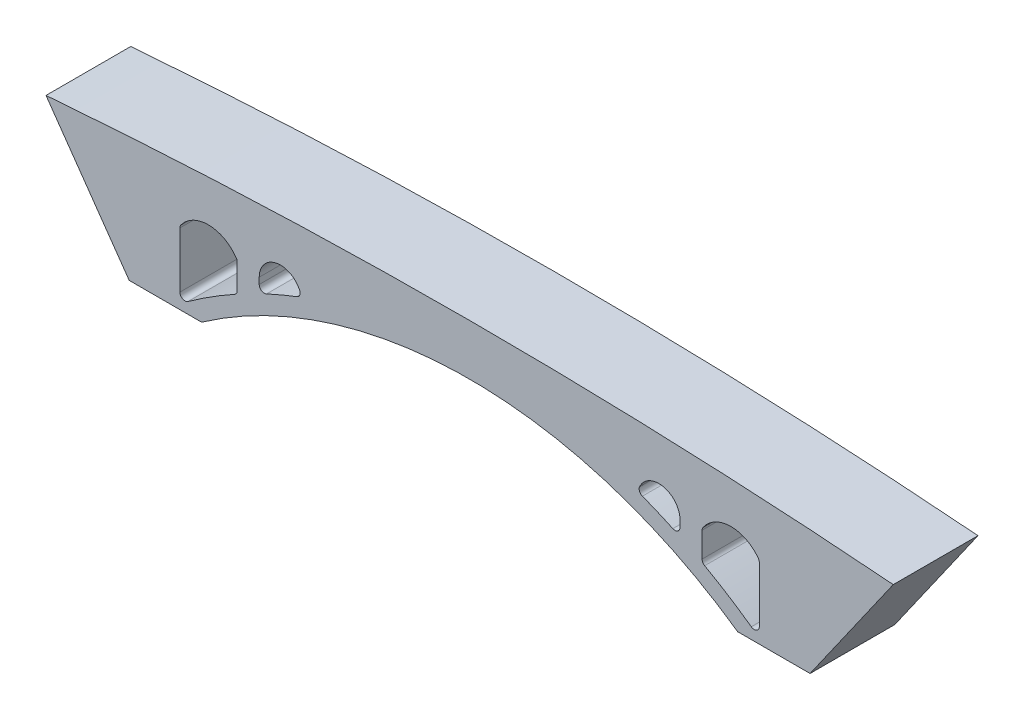
ISO-10303-21;
HEADER;
FILE_DESCRIPTION(('STEP AP214'),'2;1');
FILE_NAME('part.step','',(''),(''),'','','');
FILE_SCHEMA(('AUTOMOTIVE_DESIGN { 1 0 10303 214 1 1 1 1 }'));
ENDSEC;
DATA;
#1=APPLICATION_CONTEXT('core data for automotive mechanical design processes');
#2=APPLICATION_PROTOCOL_DEFINITION('international standard','automotive_design',2000,#1);
#3=PRODUCT_CONTEXT('',#1,'mechanical');
#4=PRODUCT('Part','Part','',(#3));
#5=PRODUCT_RELATED_PRODUCT_CATEGORY('part','',(#4));
#6=PRODUCT_DEFINITION_FORMATION('','',#4);
#7=PRODUCT_DEFINITION_CONTEXT('part definition',#1,'design');
#8=PRODUCT_DEFINITION('design','',#6,#7);
#9=PRODUCT_DEFINITION_SHAPE('','',#8);
#10=(LENGTH_UNIT() NAMED_UNIT(*) SI_UNIT(.MILLI.,.METRE.));
#11=(NAMED_UNIT(*) PLANE_ANGLE_UNIT() SI_UNIT($,.RADIAN.));
#12=(NAMED_UNIT(*) SI_UNIT($,.STERADIAN.) SOLID_ANGLE_UNIT());
#13=UNCERTAINTY_MEASURE_WITH_UNIT(LENGTH_MEASURE(1.E-05),#10,'distance_accuracy_value','');
#14=(GEOMETRIC_REPRESENTATION_CONTEXT(3) GLOBAL_UNCERTAINTY_ASSIGNED_CONTEXT((#13)) GLOBAL_UNIT_ASSIGNED_CONTEXT((#10,
#11,#12)) REPRESENTATION_CONTEXT('',''));
#15=CARTESIAN_POINT('',(0.,0.,0.));
#16=DIRECTION('',(0.,0.,1.));
#17=DIRECTION('',(1.,0.,0.));
#18=AXIS2_PLACEMENT_3D('',#15,#16,#17);
#19=CARTESIAN_POINT('',(137.172282430604,0.,50.));
#20=DIRECTION('',(1.,0.,0.));
#21=DIRECTION('',(0.,0.,-1.));
#22=AXIS2_PLACEMENT_3D('',#19,#20,#21);
#23=PLANE('',#22);
#24=DIRECTION('',(0.,-1.,0.));
#25=VECTOR('',#24,1.);
#26=CARTESIAN_POINT('',(137.172282430604,0.,50.));
#27=LINE('',#26,#25);
#28=CARTESIAN_POINT('',(137.172282430604,41.342093544758,50.));
#29=VERTEX_POINT('',#28);
#30=CARTESIAN_POINT('',(137.172282430604,26.6165555100309,50.));
#31=VERTEX_POINT('',#30);
#32=EDGE_CURVE('E492',#29,#31,#27,.T.);
#33=ORIENTED_EDGE('',*,*,#32,.T.);
#34=DIRECTION('',(0.,0.,1.));
#35=VECTOR('',#34,1.);
#36=CARTESIAN_POINT('',(137.172282430604,26.6165555100309,0.));
#37=LINE('',#36,#35);
#38=CARTESIAN_POINT('',(137.172282430604,26.6165555100309,0.));
#39=VERTEX_POINT('',#38);
#40=EDGE_CURVE('E306',#31,#39,#37,.F.);
#41=ORIENTED_EDGE('',*,*,#40,.T.);
#42=DIRECTION('',(0.,-1.,0.));
#43=VECTOR('',#42,1.);
#44=CARTESIAN_POINT('',(137.172282430604,0.,0.));
#45=LINE('',#44,#43);
#46=CARTESIAN_POINT('',(137.172282430604,41.342093544758,0.));
#47=VERTEX_POINT('',#46);
#48=EDGE_CURVE('E549',#47,#39,#45,.T.);
#49=ORIENTED_EDGE('',*,*,#48,.F.);
#50=DIRECTION('',(0.,0.,-1.));
#51=VECTOR('',#50,1.);
#52=CARTESIAN_POINT('',(137.172282430604,41.342093544758,50.));
#53=LINE('',#52,#51);
#54=EDGE_CURVE('E303',#47,#29,#53,.F.);
#55=ORIENTED_EDGE('',*,*,#54,.T.);
#56=EDGE_LOOP('',(#33,#41,#49,#55));
#57=FACE_BOUND('',#56,.T.);
#58=ADVANCED_FACE('F40',(#57),#23,.T.);
#59=CARTESIAN_POINT('',(154.22651526237,31.7776521334411,50.));
#60=DIRECTION('',(0.,0.,-1.));
#61=DIRECTION('',(-1.,0.,0.));
#62=AXIS2_PLACEMENT_3D('',#59,#60,#61);
#63=CYLINDRICAL_SURFACE('',#62,20.);
#64=CARTESIAN_POINT('',(154.22651526237,31.7776521334411,0.));
#65=DIRECTION('',(0.,0.,1.));
#66=DIRECTION('',(1.,0.,0.));
#67=AXIS2_PLACEMENT_3D('',#64,#65,#66);
#68=CIRCLE('',#67,20.);
#69=CARTESIAN_POINT('',(137.692123695587,43.0299361467551,0.));
#70=VERTEX_POINT('',#69);
#71=CARTESIAN_POINT('',(170.390355248021,43.5560338948833,0.));
#72=VERTEX_POINT('',#71);
#73=EDGE_CURVE('E553',#70,#72,#68,.F.);
#74=ORIENTED_EDGE('',*,*,#73,.T.);
#75=DIRECTION('',(0.,0.,-1.));
#76=VECTOR('',#75,1.);
#77=CARTESIAN_POINT('',(170.390355248021,43.5560338948833,50.));
#78=LINE('',#77,#76);
#79=CARTESIAN_POINT('',(170.390355248021,43.5560338948833,50.));
#80=VERTEX_POINT('',#79);
#81=EDGE_CURVE('E314',#72,#80,#78,.F.);
#82=ORIENTED_EDGE('',*,*,#81,.T.);
#83=CARTESIAN_POINT('',(154.22651526237,31.7776521334411,50.));
#84=DIRECTION('',(0.,0.,1.));
#85=DIRECTION('',(1.,0.,0.));
#86=AXIS2_PLACEMENT_3D('',#83,#84,#85);
#87=CIRCLE('',#86,20.);
#88=CARTESIAN_POINT('',(137.692123695587,43.0299361467551,50.));
#89=VERTEX_POINT('',#88);
#90=EDGE_CURVE('E496',#89,#80,#87,.F.);
#91=ORIENTED_EDGE('',*,*,#90,.F.);
#92=DIRECTION('',(0.,0.,-1.));
#93=VECTOR('',#92,1.);
#94=CARTESIAN_POINT('',(137.692123695587,43.0299361467551,50.));
#95=LINE('',#94,#93);
#96=EDGE_CURVE('E310',#89,#70,#95,.T.);
#97=ORIENTED_EDGE('',*,*,#96,.T.);
#98=EDGE_LOOP('',(#74,#82,#91,#97));
#99=FACE_BOUND('',#98,.T.);
#100=ADVANCED_FACE('F616',(#99),#63,.F.);
#101=CARTESIAN_POINT('',(170.965779250173,0.,50.));
#102=DIRECTION('',(1.,0.,0.));
#103=DIRECTION('',(0.,0.,-1.));
#104=AXIS2_PLACEMENT_3D('',#101,#102,#103);
#105=PLANE('',#104);
#106=DIRECTION('',(0.,-1.,0.));
#107=VECTOR('',#106,1.);
#108=CARTESIAN_POINT('',(170.965779250173,0.,0.));
#109=LINE('',#108,#107);
#110=CARTESIAN_POINT('',(170.965779250173,41.789276630667,0.));
#111=VERTEX_POINT('',#110);
#112=CARTESIAN_POINT('',(170.965779250173,8.99572385539235,0.));
#113=VERTEX_POINT('',#112);
#114=EDGE_CURVE('E557',#111,#113,#109,.T.);
#115=ORIENTED_EDGE('',*,*,#114,.T.);
#116=DIRECTION('',(0.,0.,-1.));
#117=VECTOR('',#116,1.);
#118=CARTESIAN_POINT('',(170.965779250173,8.99572385539235,50.));
#119=LINE('',#118,#117);
#120=CARTESIAN_POINT('',(170.965779250173,8.99572385539235,50.));
#121=VERTEX_POINT('',#120);
#122=EDGE_CURVE('E300',#113,#121,#119,.F.);
#123=ORIENTED_EDGE('',*,*,#122,.T.);
#124=DIRECTION('',(0.,-1.,0.));
#125=VECTOR('',#124,1.);
#126=CARTESIAN_POINT('',(170.965779250173,0.,50.));
#127=LINE('',#126,#125);
#128=CARTESIAN_POINT('',(170.965779250173,41.789276630667,50.));
#129=VERTEX_POINT('',#128);
#130=EDGE_CURVE('E500',#129,#121,#127,.T.);
#131=ORIENTED_EDGE('',*,*,#130,.F.);
#132=DIRECTION('',(0.,0.,1.));
#133=VECTOR('',#132,1.);
#134=CARTESIAN_POINT('',(170.965779250173,41.789276630667,0.));
#135=LINE('',#134,#133);
#136=EDGE_CURVE('E296',#129,#111,#135,.F.);
#137=ORIENTED_EDGE('',*,*,#136,.T.);
#138=EDGE_LOOP('',(#115,#123,#131,#137));
#139=FACE_BOUND('',#138,.T.);
#140=ADVANCED_FACE('F622',(#139),#105,.F.);
#141=CARTESIAN_POINT('',(0.,-225.208333333333,50.));
#142=DIRECTION('',(0.,0.,-1.));
#143=DIRECTION('',(-1.,0.,0.));
#144=AXIS2_PLACEMENT_3D('',#141,#142,#143);
#145=CYLINDRICAL_SURFACE('',#144,285.208333333333);
#146=CARTESIAN_POINT('',(0.,-225.208333333333,50.));
#147=DIRECTION('',(0.,0.,1.));
#148=DIRECTION('',(1.,0.,0.));
#149=AXIS2_PLACEMENT_3D('',#146,#147,#148);
#150=CIRCLE('',#149,285.208333333333);
#151=CARTESIAN_POINT('',(101.960983889552,41.1518573240777,50.));
#152=VERTEX_POINT('',#151);
#153=CARTESIAN_POINT('',(119.9109835532,33.5679202644069,50.));
#154=VERTEX_POINT('',#153);
#155=EDGE_CURVE('E484',#152,#154,#150,.F.);
#156=ORIENTED_EDGE('',*,*,#155,.T.);
#157=DIRECTION('',(0.,0.,-1.));
#158=VECTOR('',#157,1.);
#159=CARTESIAN_POINT('',(119.9109835532,33.567920264407,50.));
#160=LINE('',#159,#158);
#161=CARTESIAN_POINT('',(119.9109835532,33.5679202644069,0.));
#162=VERTEX_POINT('',#161);
#163=EDGE_CURVE('E320',#154,#162,#160,.T.);
#164=ORIENTED_EDGE('',*,*,#163,.T.);
#165=CARTESIAN_POINT('',(0.,-225.208333333333,0.));
#166=DIRECTION('',(0.,0.,1.));
#167=DIRECTION('',(1.,0.,0.));
#168=AXIS2_PLACEMENT_3D('',#165,#166,#167);
#169=CIRCLE('',#168,285.208333333333);
#170=CARTESIAN_POINT('',(101.960983889552,41.1518573240777,0.));
#171=VERTEX_POINT('',#170);
#172=EDGE_CURVE('E541',#171,#162,#169,.F.);
#173=ORIENTED_EDGE('',*,*,#172,.F.);
#174=DIRECTION('',(0.,0.,-1.));
#175=VECTOR('',#174,1.);
#176=CARTESIAN_POINT('',(101.960983889552,41.1518573240777,50.));
#177=LINE('',#176,#175);
#178=EDGE_CURVE('E317',#171,#152,#177,.F.);
#179=ORIENTED_EDGE('',*,*,#178,.T.);
#180=EDGE_LOOP('',(#156,#164,#173,#179));
#181=FACE_BOUND('',#180,.T.);
#182=ADVANCED_FACE('F609',(#181),#145,.T.);
#183=CARTESIAN_POINT('',(111.672282430604,40.0012623389559,50.));
#184=DIRECTION('',(0.,0.,-1.));
#185=DIRECTION('',(-1.,0.,0.));
#186=AXIS2_PLACEMENT_3D('',#183,#184,#185);
#187=CYLINDRICAL_SURFACE('',#186,12.5);
#188=CARTESIAN_POINT('',(111.672282430604,40.0012623389559,50.));
#189=DIRECTION('',(0.,0.,1.));
#190=DIRECTION('',(1.,0.,0.));
#191=AXIS2_PLACEMENT_3D('',#188,#189,#190);
#192=CIRCLE('',#191,12.5);
#193=CARTESIAN_POINT('',(100.305428470077,45.2017076122041,50.));
#194=VERTEX_POINT('',#193);
#195=CARTESIAN_POINT('',(124.172282430604,40.0012623389559,50.));
#196=VERTEX_POINT('',#195);
#197=EDGE_CURVE('E485',#194,#196,#192,.F.);
#198=ORIENTED_EDGE('',*,*,#197,.F.);
#199=DIRECTION('',(0.,0.,-1.));
#200=VECTOR('',#199,1.);
#201=CARTESIAN_POINT('',(100.305428470077,45.2017076122041,50.));
#202=LINE('',#201,#200);
#203=CARTESIAN_POINT('',(100.305428470077,45.2017076122041,0.));
#204=VERTEX_POINT('',#203);
#205=EDGE_CURVE('E327',#194,#204,#202,.T.);
#206=ORIENTED_EDGE('',*,*,#205,.T.);
#207=CARTESIAN_POINT('',(111.672282430604,40.0012623389559,0.));
#208=DIRECTION('',(0.,0.,1.));
#209=DIRECTION('',(1.,0.,0.));
#210=AXIS2_PLACEMENT_3D('',#207,#208,#209);
#211=CIRCLE('',#210,12.5);
#212=CARTESIAN_POINT('',(124.172282430604,40.0012623389559,0.));
#213=VERTEX_POINT('',#212);
#214=EDGE_CURVE('E542',#204,#213,#211,.F.);
#215=ORIENTED_EDGE('',*,*,#214,.T.);
#216=DIRECTION('',(0.,0.,-1.));
#217=VECTOR('',#216,1.);
#218=CARTESIAN_POINT('',(124.172282430604,40.0012623389559,50.));
#219=LINE('',#218,#217);
#220=EDGE_CURVE('E283',#196,#213,#219,.T.);
#221=ORIENTED_EDGE('',*,*,#220,.F.);
#222=EDGE_LOOP('',(#198,#206,#215,#221));
#223=FACE_BOUND('',#222,.T.);
#224=ADVANCED_FACE('F631',(#223),#187,.F.);
#225=CARTESIAN_POINT('',(-119.9109835532,33.5679202644069,50.));
#226=VERTEX_POINT('',#225);
#227=CARTESIAN_POINT('',(-101.960983889553,41.1518573240774,50.));
#228=VERTEX_POINT('',#227);
#229=EDGE_CURVE('E470',#226,#228,#150,.F.);
#230=ORIENTED_EDGE('',*,*,#229,.T.);
#231=DIRECTION('',(0.,0.,-1.));
#232=VECTOR('',#231,1.);
#233=CARTESIAN_POINT('',(-101.960983889553,41.1518573240774,50.));
#234=LINE('',#233,#232);
#235=CARTESIAN_POINT('',(-101.960983889553,41.1518573240774,0.));
#236=VERTEX_POINT('',#235);
#237=EDGE_CURVE('E334',#228,#236,#234,.T.);
#238=ORIENTED_EDGE('',*,*,#237,.T.);
#239=CARTESIAN_POINT('',(-119.9109835532,33.5679202644069,0.));
#240=VERTEX_POINT('',#239);
#241=EDGE_CURVE('E456',#240,#236,#169,.F.);
#242=ORIENTED_EDGE('',*,*,#241,.F.);
#243=DIRECTION('',(0.,0.,-1.));
#244=VECTOR('',#243,1.);
#245=CARTESIAN_POINT('',(-119.9109835532,33.567920264407,50.));
#246=LINE('',#245,#244);
#247=EDGE_CURVE('E331',#240,#226,#246,.F.);
#248=ORIENTED_EDGE('',*,*,#247,.T.);
#249=EDGE_LOOP('',(#230,#238,#242,#248));
#250=FACE_BOUND('',#249,.T.);
#251=ADVANCED_FACE('F634',(#250),#145,.T.);
#252=CARTESIAN_POINT('',(-124.172282430604,2.03912069555012E-13,50.));
#253=DIRECTION('',(1.,0.,0.));
#254=DIRECTION('',(0.,1.,0.));
#255=AXIS2_PLACEMENT_3D('',#252,#253,#254);
#256=PLANE('',#255);
#257=DIRECTION('',(0.,-1.,0.));
#258=VECTOR('',#257,1.);
#259=CARTESIAN_POINT('',(-124.172282430604,2.03912069555012E-13,50.));
#260=LINE('',#259,#258);
#261=CARTESIAN_POINT('',(-124.172282430604,40.0012623389559,50.));
#262=VERTEX_POINT('',#261);
#263=CARTESIAN_POINT('',(-124.172282430604,36.2898910838427,50.));
#264=VERTEX_POINT('',#263);
#265=EDGE_CURVE('E477',#262,#264,#260,.T.);
#266=ORIENTED_EDGE('',*,*,#265,.T.);
#267=DIRECTION('',(0.,0.,1.));
#268=VECTOR('',#267,1.);
#269=CARTESIAN_POINT('',(-124.172282430604,36.2898910838427,0.));
#270=LINE('',#269,#268);
#271=CARTESIAN_POINT('',(-124.172282430604,36.2898910838427,0.));
#272=VERTEX_POINT('',#271);
#273=EDGE_CURVE('E341',#264,#272,#270,.F.);
#274=ORIENTED_EDGE('',*,*,#273,.T.);
#275=DIRECTION('',(0.,-1.,0.));
#276=VECTOR('',#275,1.);
#277=CARTESIAN_POINT('',(-124.172282430604,2.03912069555012E-13,0.));
#278=LINE('',#277,#276);
#279=CARTESIAN_POINT('',(-124.172282430604,40.0012623389559,0.));
#280=VERTEX_POINT('',#279);
#281=EDGE_CURVE('E534',#280,#272,#278,.T.);
#282=ORIENTED_EDGE('',*,*,#281,.F.);
#283=DIRECTION('',(0.,0.,-1.));
#284=VECTOR('',#283,1.);
#285=CARTESIAN_POINT('',(-124.172282430604,40.0012623389559,50.));
#286=LINE('',#285,#284);
#287=EDGE_CURVE('E278',#262,#280,#286,.T.);
#288=ORIENTED_EDGE('',*,*,#287,.F.);
#289=EDGE_LOOP('',(#266,#274,#282,#288));
#290=FACE_BOUND('',#289,.T.);
#291=ADVANCED_FACE('F639',(#290),#256,.T.);
#292=CARTESIAN_POINT('',(-166.21740045792,6.55786175945652,50.));
#293=VERTEX_POINT('',#292);
#294=CARTESIAN_POINT('',(-138.713209951928,23.9952757649504,50.));
#295=VERTEX_POINT('',#294);
#296=EDGE_CURVE('E462',#293,#295,#150,.F.);
#297=ORIENTED_EDGE('',*,*,#296,.T.);
#298=DIRECTION('',(0.,0.,-1.));
#299=VECTOR('',#298,1.);
#300=CARTESIAN_POINT('',(-138.713209951928,23.9952757649504,50.));
#301=LINE('',#300,#299);
#302=CARTESIAN_POINT('',(-138.713209951928,23.9952757649504,0.));
#303=VERTEX_POINT('',#302);
#304=EDGE_CURVE('E348',#295,#303,#301,.T.);
#305=ORIENTED_EDGE('',*,*,#304,.T.);
#306=CARTESIAN_POINT('',(-166.21740045792,6.55786175945652,0.));
#307=VERTEX_POINT('',#306);
#308=EDGE_CURVE('E444',#307,#303,#169,.F.);
#309=ORIENTED_EDGE('',*,*,#308,.F.);
#310=DIRECTION('',(0.,0.,-1.));
#311=VECTOR('',#310,1.);
#312=CARTESIAN_POINT('',(-166.21740045792,6.55786175945652,50.));
#313=LINE('',#312,#311);
#314=EDGE_CURVE('E345',#307,#293,#313,.F.);
#315=ORIENTED_EDGE('',*,*,#314,.T.);
#316=EDGE_LOOP('',(#297,#305,#309,#315));
#317=FACE_BOUND('',#316,.T.);
#318=ADVANCED_FACE('F451',(#317),#145,.T.);
#319=CARTESIAN_POINT('',(-170.965779250173,0.,50.));
#320=DIRECTION('',(1.,0.,0.));
#321=DIRECTION('',(0.,0.,-1.));
#322=AXIS2_PLACEMENT_3D('',#319,#320,#321);
#323=PLANE('',#322);
#324=DIRECTION('',(0.,-1.,0.));
#325=VECTOR('',#324,1.);
#326=CARTESIAN_POINT('',(-170.965779250173,0.,0.));
#327=LINE('',#326,#325);
#328=CARTESIAN_POINT('',(-170.965779250173,41.789276630667,0.));
#329=VERTEX_POINT('',#328);
#330=CARTESIAN_POINT('',(-170.965779250173,8.99572385539235,0.));
#331=VERTEX_POINT('',#330);
#332=EDGE_CURVE('E445',#329,#331,#327,.T.);
#333=ORIENTED_EDGE('',*,*,#332,.F.);
#334=DIRECTION('',(0.,0.,1.));
#335=VECTOR('',#334,1.);
#336=CARTESIAN_POINT('',(-170.965779250173,41.789276630667,50.));
#337=LINE('',#336,#335);
#338=CARTESIAN_POINT('',(-170.965779250173,41.789276630667,50.));
#339=VERTEX_POINT('',#338);
#340=EDGE_CURVE('E61',#329,#339,#337,.T.);
#341=ORIENTED_EDGE('',*,*,#340,.T.);
#342=DIRECTION('',(0.,-1.,0.));
#343=VECTOR('',#342,1.);
#344=CARTESIAN_POINT('',(-170.965779250173,0.,50.));
#345=LINE('',#344,#343);
#346=CARTESIAN_POINT('',(-170.965779250173,8.99572385539235,50.));
#347=VERTEX_POINT('',#346);
#348=EDGE_CURVE('E458',#339,#347,#345,.T.);
#349=ORIENTED_EDGE('',*,*,#348,.T.);
#350=DIRECTION('',(0.,0.,1.));
#351=VECTOR('',#350,1.);
#352=CARTESIAN_POINT('',(-170.965779250173,8.99572385539235,0.));
#353=LINE('',#352,#351);
#354=EDGE_CURVE('E366',#347,#331,#353,.F.);
#355=ORIENTED_EDGE('',*,*,#354,.T.);
#356=EDGE_LOOP('',(#333,#341,#349,#355));
#357=FACE_BOUND('',#356,.T.);
#358=ADVANCED_FACE('F457',(#357),#323,.T.);
#359=CARTESIAN_POINT('',(-154.22651526237,31.7776521334411,50.));
#360=DIRECTION('',(0.,0.,-1.));
#361=DIRECTION('',(-1.,0.,0.));
#362=AXIS2_PLACEMENT_3D('',#359,#360,#361);
#363=CYLINDRICAL_SURFACE('',#362,20.);
#364=CARTESIAN_POINT('',(-154.22651526237,31.7776521334411,0.));
#365=DIRECTION('',(0.,0.,1.));
#366=DIRECTION('',(1.,0.,0.));
#367=AXIS2_PLACEMENT_3D('',#364,#365,#366);
#368=CIRCLE('',#367,20.);
#369=CARTESIAN_POINT('',(-137.692123695587,43.0299361467551,0.));
#370=VERTEX_POINT('',#369);
#371=CARTESIAN_POINT('',(-170.390355248021,43.5560338948833,0.));
#372=VERTEX_POINT('',#371);
#373=EDGE_CURVE('E526',#370,#372,#368,.T.);
#374=ORIENTED_EDGE('',*,*,#373,.F.);
#375=DIRECTION('',(0.,0.,-1.));
#376=VECTOR('',#375,1.);
#377=CARTESIAN_POINT('',(-137.692123695587,43.0299361467551,50.));
#378=LINE('',#377,#376);
#379=CARTESIAN_POINT('',(-137.692123695587,43.0299361467551,50.));
#380=VERTEX_POINT('',#379);
#381=EDGE_CURVE('E363',#370,#380,#378,.F.);
#382=ORIENTED_EDGE('',*,*,#381,.T.);
#383=CARTESIAN_POINT('',(-154.22651526237,31.7776521334411,50.));
#384=DIRECTION('',(0.,0.,1.));
#385=DIRECTION('',(1.,0.,0.));
#386=AXIS2_PLACEMENT_3D('',#383,#384,#385);
#387=CIRCLE('',#386,20.);
#388=CARTESIAN_POINT('',(-170.390355248021,43.5560338948833,50.));
#389=VERTEX_POINT('',#388);
#390=EDGE_CURVE('E461',#380,#389,#387,.T.);
#391=ORIENTED_EDGE('',*,*,#390,.T.);
#392=DIRECTION('',(0.,0.,-1.));
#393=VECTOR('',#392,1.);
#394=CARTESIAN_POINT('',(-170.390355248021,43.5560338948833,50.));
#395=LINE('',#394,#393);
#396=EDGE_CURVE('E359',#389,#372,#395,.T.);
#397=ORIENTED_EDGE('',*,*,#396,.T.);
#398=EDGE_LOOP('',(#374,#382,#391,#397));
#399=FACE_BOUND('',#398,.T.);
#400=ADVANCED_FACE('F643',(#399),#363,.F.);
#401=CARTESIAN_POINT('',(0.,-225.208333333333,50.));
#402=DIRECTION('',(0.,0.,-1.));
#403=DIRECTION('',(-1.,0.,0.));
#404=AXIS2_PLACEMENT_3D('',#401,#402,#403);
#405=CYLINDRICAL_SURFACE('',#404,275.208333333333);
#406=CARTESIAN_POINT('',(0.,-225.208333333333,0.));
#407=DIRECTION('',(0.,0.,1.));
#408=DIRECTION('',(1.,0.,0.));
#409=AXIS2_PLACEMENT_3D('',#406,#407,#408);
#410=CIRCLE('',#409,275.208333333333);
#411=CARTESIAN_POINT('',(-158.179750073558,0.,0.));
#412=VERTEX_POINT('',#411);
#413=CARTESIAN_POINT('',(158.179750073558,0.,0.));
#414=VERTEX_POINT('',#413);
#415=EDGE_CURVE('E276',#412,#414,#410,.F.);
#416=ORIENTED_EDGE('',*,*,#415,.T.);
#417=DIRECTION('',(0.,0.,-1.));
#418=VECTOR('',#417,1.);
#419=CARTESIAN_POINT('',(158.179750073558,0.,50.));
#420=LINE('',#419,#418);
#421=CARTESIAN_POINT('',(158.179750073558,0.,50.));
#422=VERTEX_POINT('',#421);
#423=EDGE_CURVE('E254',#422,#414,#420,.T.);
#424=ORIENTED_EDGE('',*,*,#423,.F.);
#425=CARTESIAN_POINT('',(0.,-225.208333333333,50.));
#426=DIRECTION('',(0.,0.,1.));
#427=DIRECTION('',(1.,0.,0.));
#428=AXIS2_PLACEMENT_3D('',#425,#426,#427);
#429=CIRCLE('',#428,275.208333333333);
#430=CARTESIAN_POINT('',(-158.179750073558,0.,50.));
#431=VERTEX_POINT('',#430);
#432=EDGE_CURVE('E262',#431,#422,#429,.F.);
#433=ORIENTED_EDGE('',*,*,#432,.F.);
#434=DIRECTION('',(0.,0.,-1.));
#435=VECTOR('',#434,1.);
#436=CARTESIAN_POINT('',(-158.179750073558,0.,50.));
#437=LINE('',#436,#435);
#438=EDGE_CURVE('E564',#431,#412,#437,.T.);
#439=ORIENTED_EDGE('',*,*,#438,.T.);
#440=EDGE_LOOP('',(#416,#424,#433,#439));
#441=FACE_BOUND('',#440,.T.);
#442=ADVANCED_FACE('F274',(#441),#405,.F.);
#443=CARTESIAN_POINT('',(0.,0.,50.));
#444=DIRECTION('',(0.,1.,0.));
#445=DIRECTION('',(-1.,0.,0.));
#446=AXIS2_PLACEMENT_3D('',#443,#444,#445);
#447=PLANE('',#446);
#448=DIRECTION('',(1.,0.,0.));
#449=VECTOR('',#448,1.);
#450=CARTESIAN_POINT('',(0.,0.,0.));
#451=LINE('',#450,#449);
#452=CARTESIAN_POINT('',(200.898692043506,-4.52089729206739E-13,0.));
#453=VERTEX_POINT('',#452);
#454=EDGE_CURVE('E506',#414,#453,#451,.T.);
#455=ORIENTED_EDGE('',*,*,#454,.T.);
#456=DIRECTION('',(0.,0.,-1.));
#457=VECTOR('',#456,1.);
#458=CARTESIAN_POINT('',(200.898692043506,-4.52089729206739E-13,50.));
#459=LINE('',#458,#457);
#460=CARTESIAN_POINT('',(200.898692043506,-4.52089729206739E-13,50.));
#461=VERTEX_POINT('',#460);
#462=EDGE_CURVE('E257',#461,#453,#459,.T.);
#463=ORIENTED_EDGE('',*,*,#462,.F.);
#464=DIRECTION('',(1.,0.,0.));
#465=VECTOR('',#464,1.);
#466=CARTESIAN_POINT('',(0.,0.,50.));
#467=LINE('',#466,#465);
#468=EDGE_CURVE('E250',#422,#461,#467,.T.);
#469=ORIENTED_EDGE('',*,*,#468,.F.);
#470=ORIENTED_EDGE('',*,*,#423,.T.);
#471=EDGE_LOOP('',(#455,#463,#469,#470));
#472=FACE_BOUND('',#471,.T.);
#473=ADVANCED_FACE('F252',(#472),#447,.F.);
#474=CARTESIAN_POINT('',(134.648048083423,-94.44850392407,50.));
#475=DIRECTION('',(-0.818674901831811,0.574257263872799,0.));
#476=DIRECTION('',(-0.574257263872799,-0.818674901831811,0.));
#477=AXIS2_PLACEMENT_3D('',#474,#475,#476);
#478=PLANE('',#477);
#479=DIRECTION('',(0.5742572638728,0.818674901831811,0.));
#480=VECTOR('',#479,1.);
#481=CARTESIAN_POINT('',(134.648048083423,-94.44850392407,0.));
#482=LINE('',#481,#480);
#483=CARTESIAN_POINT('',(250.,70.,0.));
#484=VERTEX_POINT('',#483);
#485=EDGE_CURVE('E509',#453,#484,#482,.T.);
#486=ORIENTED_EDGE('',*,*,#485,.T.);
#487=DIRECTION('',(0.,0.,-1.));
#488=VECTOR('',#487,1.);
#489=CARTESIAN_POINT('',(250.,70.,50.));
#490=LINE('',#489,#488);
#491=CARTESIAN_POINT('',(250.,70.,50.));
#492=VERTEX_POINT('',#491);
#493=EDGE_CURVE('E285',#492,#484,#490,.T.);
#494=ORIENTED_EDGE('',*,*,#493,.F.);
#495=DIRECTION('',(0.5742572638728,0.818674901831811,0.));
#496=VECTOR('',#495,1.);
#497=CARTESIAN_POINT('',(134.648048083423,-94.44850392407,50.));
#498=LINE('',#497,#496);
#499=EDGE_CURVE('E261',#461,#492,#498,.T.);
#500=ORIENTED_EDGE('',*,*,#499,.F.);
#501=ORIENTED_EDGE('',*,*,#462,.T.);
#502=EDGE_LOOP('',(#486,#494,#500,#501));
#503=FACE_BOUND('',#502,.T.);
#504=ADVANCED_FACE('F582',(#503),#478,.F.);
#505=CARTESIAN_POINT('',(0.,-3049.99999999999,50.));
#506=DIRECTION('',(0.,0.,-1.));
#507=DIRECTION('',(-1.,0.,0.));
#508=AXIS2_PLACEMENT_3D('',#505,#506,#507);
#509=CYLINDRICAL_SURFACE('',#508,3129.99999999999);
#510=CARTESIAN_POINT('',(0.,-3049.99999999999,0.));
#511=DIRECTION('',(0.,0.,1.));
#512=DIRECTION('',(1.,0.,0.));
#513=AXIS2_PLACEMENT_3D('',#510,#511,#512);
#514=CIRCLE('',#513,3129.99999999999);
#515=CARTESIAN_POINT('',(-250.,70.,0.));
#516=VERTEX_POINT('',#515);
#517=EDGE_CURVE('E513',#516,#484,#514,.F.);
#518=ORIENTED_EDGE('',*,*,#517,.F.);
#519=DIRECTION('',(0.,0.,-1.));
#520=VECTOR('',#519,1.);
#521=CARTESIAN_POINT('',(-250.,70.,50.));
#522=LINE('',#521,#520);
#523=CARTESIAN_POINT('',(-250.,70.,50.));
#524=VERTEX_POINT('',#523);
#525=EDGE_CURVE('E570',#524,#516,#522,.T.);
#526=ORIENTED_EDGE('',*,*,#525,.F.);
#527=CARTESIAN_POINT('',(0.,-3049.99999999999,50.));
#528=DIRECTION('',(0.,0.,1.));
#529=DIRECTION('',(1.,0.,0.));
#530=AXIS2_PLACEMENT_3D('',#527,#528,#529);
#531=CIRCLE('',#530,3129.99999999999);
#532=EDGE_CURVE('E579',#524,#492,#531,.F.);
#533=ORIENTED_EDGE('',*,*,#532,.T.);
#534=ORIENTED_EDGE('',*,*,#493,.T.);
#535=EDGE_LOOP('',(#518,#526,#533,#534));
#536=FACE_BOUND('',#535,.T.);
#537=ADVANCED_FACE('F577',(#536),#509,.T.);
#538=CARTESIAN_POINT('',(-134.648048083423,-94.44850392407,50.));
#539=DIRECTION('',(-0.818674901831811,-0.574257263872799,0.));
#540=DIRECTION('',(0.574257263872799,-0.818674901831811,0.));
#541=AXIS2_PLACEMENT_3D('',#538,#539,#540);
#542=PLANE('',#541);
#543=DIRECTION('',(-0.5742572638728,0.818674901831811,0.));
#544=VECTOR('',#543,1.);
#545=CARTESIAN_POINT('',(-134.648048083423,-94.44850392407,0.));
#546=LINE('',#545,#544);
#547=CARTESIAN_POINT('',(-200.898692043506,3.79134478107815E-13,0.));
#548=VERTEX_POINT('',#547);
#549=EDGE_CURVE('E517',#548,#516,#546,.T.);
#550=ORIENTED_EDGE('',*,*,#549,.F.);
#551=DIRECTION('',(0.,0.,-1.));
#552=VECTOR('',#551,1.);
#553=CARTESIAN_POINT('',(-200.898692043506,3.79134478107815E-13,50.));
#554=LINE('',#553,#552);
#555=CARTESIAN_POINT('',(-200.898692043506,3.79134478107815E-13,50.));
#556=VERTEX_POINT('',#555);
#557=EDGE_CURVE('E567',#556,#548,#554,.T.);
#558=ORIENTED_EDGE('',*,*,#557,.F.);
#559=DIRECTION('',(-0.5742572638728,0.818674901831811,0.));
#560=VECTOR('',#559,1.);
#561=CARTESIAN_POINT('',(-134.648048083423,-94.44850392407,50.));
#562=LINE('',#561,#560);
#563=EDGE_CURVE('E589',#556,#524,#562,.T.);
#564=ORIENTED_EDGE('',*,*,#563,.T.);
#565=ORIENTED_EDGE('',*,*,#525,.T.);
#566=EDGE_LOOP('',(#550,#558,#564,#565));
#567=FACE_BOUND('',#566,.T.);
#568=ADVANCED_FACE('F587',(#567),#542,.T.);
#569=CARTESIAN_POINT('',(124.172282430604,2.03912069555012E-13,50.));
#570=DIRECTION('',(1.,0.,0.));
#571=DIRECTION('',(0.,1.,0.));
#572=AXIS2_PLACEMENT_3D('',#569,#570,#571);
#573=PLANE('',#572);
#574=DIRECTION('',(0.,-1.,0.));
#575=VECTOR('',#574,1.);
#576=CARTESIAN_POINT('',(124.172282430604,2.03912069555012E-13,0.));
#577=LINE('',#576,#575);
#578=CARTESIAN_POINT('',(124.172282430604,36.2898910838427,0.));
#579=VERTEX_POINT('',#578);
#580=EDGE_CURVE('E545',#213,#579,#577,.T.);
#581=ORIENTED_EDGE('',*,*,#580,.T.);
#582=DIRECTION('',(0.,0.,-1.));
#583=VECTOR('',#582,1.);
#584=CARTESIAN_POINT('',(124.172282430604,36.2898910838427,50.));
#585=LINE('',#584,#583);
#586=CARTESIAN_POINT('',(124.172282430604,36.2898910838427,50.));
#587=VERTEX_POINT('',#586);
#588=EDGE_CURVE('E324',#579,#587,#585,.F.);
#589=ORIENTED_EDGE('',*,*,#588,.T.);
#590=DIRECTION('',(0.,-1.,0.));
#591=VECTOR('',#590,1.);
#592=CARTESIAN_POINT('',(124.172282430604,2.03912069555012E-13,50.));
#593=LINE('',#592,#591);
#594=EDGE_CURVE('E488',#196,#587,#593,.T.);
#595=ORIENTED_EDGE('',*,*,#594,.F.);
#596=ORIENTED_EDGE('',*,*,#220,.T.);
#597=EDGE_LOOP('',(#581,#589,#595,#596));
#598=FACE_BOUND('',#597,.T.);
#599=ADVANCED_FACE('F627',(#598),#573,.F.);
#600=CARTESIAN_POINT('',(-111.672282430604,40.0012623389559,50.));
#601=DIRECTION('',(0.,0.,-1.));
#602=DIRECTION('',(-1.,0.,0.));
#603=AXIS2_PLACEMENT_3D('',#600,#601,#602);
#604=CYLINDRICAL_SURFACE('',#603,12.5);
#605=CARTESIAN_POINT('',(-111.672282430604,40.0012623389559,0.));
#606=DIRECTION('',(0.,0.,1.));
#607=DIRECTION('',(1.,0.,0.));
#608=AXIS2_PLACEMENT_3D('',#605,#606,#607);
#609=CIRCLE('',#608,12.5);
#610=CARTESIAN_POINT('',(-100.305428470077,45.2017076122042,0.));
#611=VERTEX_POINT('',#610);
#612=EDGE_CURVE('E538',#611,#280,#609,.T.);
#613=ORIENTED_EDGE('',*,*,#612,.F.);
#614=DIRECTION('',(0.,0.,-1.));
#615=VECTOR('',#614,1.);
#616=CARTESIAN_POINT('',(-100.305428470077,45.2017076122042,50.));
#617=LINE('',#616,#615);
#618=CARTESIAN_POINT('',(-100.305428470077,45.2017076122042,50.));
#619=VERTEX_POINT('',#618);
#620=EDGE_CURVE('E338',#611,#619,#617,.F.);
#621=ORIENTED_EDGE('',*,*,#620,.T.);
#622=CARTESIAN_POINT('',(-111.672282430604,40.0012623389559,50.));
#623=DIRECTION('',(0.,0.,1.));
#624=DIRECTION('',(1.,0.,0.));
#625=AXIS2_PLACEMENT_3D('',#622,#623,#624);
#626=CIRCLE('',#625,12.5);
#627=EDGE_CURVE('E481',#619,#262,#626,.T.);
#628=ORIENTED_EDGE('',*,*,#627,.T.);
#629=ORIENTED_EDGE('',*,*,#287,.T.);
#630=EDGE_LOOP('',(#613,#621,#628,#629));
#631=FACE_BOUND('',#630,.T.);
#632=ADVANCED_FACE('F610',(#631),#604,.F.);
#633=CARTESIAN_POINT('',(-137.172282430604,0.,50.));
#634=DIRECTION('',(1.,0.,0.));
#635=DIRECTION('',(0.,0.,-1.));
#636=AXIS2_PLACEMENT_3D('',#633,#634,#635);
#637=PLANE('',#636);
#638=DIRECTION('',(0.,-1.,0.));
#639=VECTOR('',#638,1.);
#640=CARTESIAN_POINT('',(-137.172282430604,0.,0.));
#641=LINE('',#640,#639);
#642=CARTESIAN_POINT('',(-137.172282430604,41.342093544758,0.));
#643=VERTEX_POINT('',#642);
#644=CARTESIAN_POINT('',(-137.172282430604,26.6165555100309,0.));
#645=VERTEX_POINT('',#644);
#646=EDGE_CURVE('E530',#643,#645,#641,.T.);
#647=ORIENTED_EDGE('',*,*,#646,.T.);
#648=DIRECTION('',(0.,0.,-1.));
#649=VECTOR('',#648,1.);
#650=CARTESIAN_POINT('',(-137.172282430604,26.6165555100309,50.));
#651=LINE('',#650,#649);
#652=CARTESIAN_POINT('',(-137.172282430604,26.6165555100309,50.));
#653=VERTEX_POINT('',#652);
#654=EDGE_CURVE('E356',#645,#653,#651,.F.);
#655=ORIENTED_EDGE('',*,*,#654,.T.);
#656=DIRECTION('',(0.,-1.,0.));
#657=VECTOR('',#656,1.);
#658=CARTESIAN_POINT('',(-137.172282430604,0.,50.));
#659=LINE('',#658,#657);
#660=CARTESIAN_POINT('',(-137.172282430604,41.342093544758,50.));
#661=VERTEX_POINT('',#660);
#662=EDGE_CURVE('E467',#661,#653,#659,.T.);
#663=ORIENTED_EDGE('',*,*,#662,.F.);
#664=DIRECTION('',(0.,0.,-1.));
#665=VECTOR('',#664,1.);
#666=CARTESIAN_POINT('',(-137.172282430604,41.342093544758,50.));
#667=LINE('',#666,#665);
#668=EDGE_CURVE('E352',#661,#643,#667,.T.);
#669=ORIENTED_EDGE('',*,*,#668,.T.);
#670=EDGE_LOOP('',(#647,#655,#663,#669));
#671=FACE_BOUND('',#670,.T.);
#672=ADVANCED_FACE('F601',(#671),#637,.F.);
#673=CARTESIAN_POINT('',(0.,0.,50.));
#674=DIRECTION('',(0.,-1.,0.));
#675=DIRECTION('',(1.,0.,0.));
#676=AXIS2_PLACEMENT_3D('',#673,#674,#675);
#677=PLANE('',#676);
#678=DIRECTION('',(-1.,0.,0.));
#679=VECTOR('',#678,1.);
#680=CARTESIAN_POINT('',(0.,0.,0.));
#681=LINE('',#680,#679);
#682=EDGE_CURVE('E454',#412,#548,#681,.T.);
#683=ORIENTED_EDGE('',*,*,#682,.F.);
#684=ORIENTED_EDGE('',*,*,#438,.F.);
#685=DIRECTION('',(-1.,0.,0.));
#686=VECTOR('',#685,1.);
#687=CARTESIAN_POINT('',(0.,0.,50.));
#688=LINE('',#687,#686);
#689=EDGE_CURVE('E269',#431,#556,#688,.T.);
#690=ORIENTED_EDGE('',*,*,#689,.T.);
#691=ORIENTED_EDGE('',*,*,#557,.T.);
#692=EDGE_LOOP('',(#683,#684,#690,#691));
#693=FACE_BOUND('',#692,.T.);
#694=ADVANCED_FACE('F598',(#693),#677,.T.);
#695=CARTESIAN_POINT('',(138.713209951928,23.9952757649504,50.));
#696=VERTEX_POINT('',#695);
#697=CARTESIAN_POINT('',(166.21740045792,6.55786175945652,50.));
#698=VERTEX_POINT('',#697);
#699=EDGE_CURVE('E471',#696,#698,#150,.F.);
#700=ORIENTED_EDGE('',*,*,#699,.T.);
#701=DIRECTION('',(0.,0.,-1.));
#702=VECTOR('',#701,1.);
#703=CARTESIAN_POINT('',(166.21740045792,6.55786175945652,50.));
#704=LINE('',#703,#702);
#705=CARTESIAN_POINT('',(166.21740045792,6.55786175945652,0.));
#706=VERTEX_POINT('',#705);
#707=EDGE_CURVE('E292',#698,#706,#704,.T.);
#708=ORIENTED_EDGE('',*,*,#707,.T.);
#709=CARTESIAN_POINT('',(138.713209951928,23.9952757649504,0.));
#710=VERTEX_POINT('',#709);
#711=EDGE_CURVE('E272',#710,#706,#169,.F.);
#712=ORIENTED_EDGE('',*,*,#711,.F.);
#713=DIRECTION('',(0.,0.,-1.));
#714=VECTOR('',#713,1.);
#715=CARTESIAN_POINT('',(138.713209951928,23.9952757649504,50.));
#716=LINE('',#715,#714);
#717=EDGE_CURVE('E289',#710,#696,#716,.F.);
#718=ORIENTED_EDGE('',*,*,#717,.T.);
#719=EDGE_LOOP('',(#700,#708,#712,#718));
#720=FACE_BOUND('',#719,.T.);
#721=ADVANCED_FACE('F600',(#720),#145,.T.);
#722=CARTESIAN_POINT('',(0.,0.,50.));
#723=DIRECTION('',(0.,0.,1.));
#724=DIRECTION('',(1.,0.,0.));
#725=AXIS2_PLACEMENT_3D('',#722,#723,#724);
#726=PLANE('',#725);
#727=ORIENTED_EDGE('',*,*,#432,.T.);
#728=ORIENTED_EDGE('',*,*,#468,.T.);
#729=ORIENTED_EDGE('',*,*,#499,.T.);
#730=ORIENTED_EDGE('',*,*,#532,.F.);
#731=ORIENTED_EDGE('',*,*,#563,.F.);
#732=ORIENTED_EDGE('',*,*,#689,.F.);
#733=EDGE_LOOP('',(#727,#728,#729,#730,#731,#732));
#734=FACE_BOUND('',#733,.T.);
#735=ORIENTED_EDGE('',*,*,#296,.F.);
#736=CARTESIAN_POINT('',(-167.965779250173,8.99572385539235,50.));
#737=DIRECTION('',(0.,0.,1.));
#738=DIRECTION('',(1.,0.,0.));
#739=AXIS2_PLACEMENT_3D('',#736,#737,#738);
#740=CIRCLE('',#739,3.);
#741=EDGE_CURVE('E11',#293,#347,#740,.F.);
#742=ORIENTED_EDGE('',*,*,#741,.T.);
#743=ORIENTED_EDGE('',*,*,#348,.F.);
#744=CARTESIAN_POINT('',(-167.965779250173,41.789276630667,50.));
#745=DIRECTION('',(0.,0.,1.));
#746=DIRECTION('',(1.,0.,0.));
#747=AXIS2_PLACEMENT_3D('',#744,#745,#746);
#748=CIRCLE('',#747,3.);
#749=EDGE_CURVE('E435',#339,#389,#748,.F.);
#750=ORIENTED_EDGE('',*,*,#749,.T.);
#751=ORIENTED_EDGE('',*,*,#390,.F.);
#752=CARTESIAN_POINT('',(-140.172282430604,41.342093544758,50.));
#753=DIRECTION('',(0.,0.,1.));
#754=DIRECTION('',(1.,0.,0.));
#755=AXIS2_PLACEMENT_3D('',#752,#753,#754);
#756=CIRCLE('',#755,3.);
#757=EDGE_CURVE('E429',#380,#661,#756,.F.);
#758=ORIENTED_EDGE('',*,*,#757,.T.);
#759=ORIENTED_EDGE('',*,*,#662,.T.);
#760=CARTESIAN_POINT('',(-140.172282430604,26.6165555100309,50.));
#761=DIRECTION('',(0.,0.,1.));
#762=DIRECTION('',(1.,0.,0.));
#763=AXIS2_PLACEMENT_3D('',#760,#761,#762);
#764=CIRCLE('',#763,3.);
#765=EDGE_CURVE('E423',#653,#295,#764,.F.);
#766=ORIENTED_EDGE('',*,*,#765,.T.);
#767=EDGE_LOOP('',(#735,#742,#743,#750,#751,#758,#759,#766));
#768=FACE_BOUND('',#767,.T.);
#769=ORIENTED_EDGE('',*,*,#229,.F.);
#770=CARTESIAN_POINT('',(-121.172282430604,36.2898910838426,50.));
#771=DIRECTION('',(0.,0.,1.));
#772=DIRECTION('',(1.,0.,0.));
#773=AXIS2_PLACEMENT_3D('',#770,#771,#772);
#774=CIRCLE('',#773,3.);
#775=EDGE_CURVE('E417',#226,#264,#774,.F.);
#776=ORIENTED_EDGE('',*,*,#775,.T.);
#777=ORIENTED_EDGE('',*,*,#265,.F.);
#778=ORIENTED_EDGE('',*,*,#627,.F.);
#779=CARTESIAN_POINT('',(-103.033473420604,43.9536007466243,50.));
#780=DIRECTION('',(0.,0.,1.));
#781=DIRECTION('',(1.,0.,0.));
#782=AXIS2_PLACEMENT_3D('',#779,#780,#781);
#783=CIRCLE('',#782,3.);
#784=EDGE_CURVE('E411',#619,#228,#783,.F.);
#785=ORIENTED_EDGE('',*,*,#784,.T.);
#786=EDGE_LOOP('',(#769,#776,#777,#778,#785));
#787=FACE_BOUND('',#786,.T.);
#788=ORIENTED_EDGE('',*,*,#155,.F.);
#789=CARTESIAN_POINT('',(103.033473420603,43.9536007466246,50.));
#790=DIRECTION('',(0.,0.,1.));
#791=DIRECTION('',(1.,0.,0.));
#792=AXIS2_PLACEMENT_3D('',#789,#790,#791);
#793=CIRCLE('',#792,3.);
#794=EDGE_CURVE('E405',#152,#194,#793,.F.);
#795=ORIENTED_EDGE('',*,*,#794,.T.);
#796=ORIENTED_EDGE('',*,*,#197,.T.);
#797=ORIENTED_EDGE('',*,*,#594,.T.);
#798=CARTESIAN_POINT('',(121.172282430604,36.2898910838426,50.));
#799=DIRECTION('',(0.,0.,1.));
#800=DIRECTION('',(1.,0.,0.));
#801=AXIS2_PLACEMENT_3D('',#798,#799,#800);
#802=CIRCLE('',#801,3.);
#803=EDGE_CURVE('E399',#587,#154,#802,.F.);
#804=ORIENTED_EDGE('',*,*,#803,.T.);
#805=EDGE_LOOP('',(#788,#795,#796,#797,#804));
#806=FACE_BOUND('',#805,.T.);
#807=ORIENTED_EDGE('',*,*,#32,.F.);
#808=CARTESIAN_POINT('',(140.172282430604,41.342093544758,50.));
#809=DIRECTION('',(0.,0.,1.));
#810=DIRECTION('',(1.,0.,0.));
#811=AXIS2_PLACEMENT_3D('',#808,#809,#810);
#812=CIRCLE('',#811,3.);
#813=EDGE_CURVE('E393',#29,#89,#812,.F.);
#814=ORIENTED_EDGE('',*,*,#813,.T.);
#815=ORIENTED_EDGE('',*,*,#90,.T.);
#816=CARTESIAN_POINT('',(167.965779250173,41.789276630667,50.));
#817=DIRECTION('',(0.,0.,1.));
#818=DIRECTION('',(1.,0.,0.));
#819=AXIS2_PLACEMENT_3D('',#816,#817,#818);
#820=CIRCLE('',#819,3.);
#821=EDGE_CURVE('E387',#80,#129,#820,.F.);
#822=ORIENTED_EDGE('',*,*,#821,.T.);
#823=ORIENTED_EDGE('',*,*,#130,.T.);
#824=CARTESIAN_POINT('',(167.965779250173,8.99572385539235,50.));
#825=DIRECTION('',(0.,0.,1.));
#826=DIRECTION('',(1.,0.,0.));
#827=AXIS2_PLACEMENT_3D('',#824,#825,#826);
#828=CIRCLE('',#827,3.);
#829=EDGE_CURVE('E375',#121,#698,#828,.F.);
#830=ORIENTED_EDGE('',*,*,#829,.T.);
#831=ORIENTED_EDGE('',*,*,#699,.F.);
#832=CARTESIAN_POINT('',(140.172282430604,26.6165555100309,50.));
#833=DIRECTION('',(0.,0.,1.));
#834=DIRECTION('',(1.,0.,0.));
#835=AXIS2_PLACEMENT_3D('',#832,#833,#834);
#836=CIRCLE('',#835,3.);
#837=EDGE_CURVE('E381',#696,#31,#836,.F.);
#838=ORIENTED_EDGE('',*,*,#837,.T.);
#839=EDGE_LOOP('',(#807,#814,#815,#822,#823,#830,#831,#838));
#840=FACE_BOUND('',#839,.T.);
#841=ADVANCED_FACE('F266',(#734,#768,#787,#806,#840),#726,.T.);
#842=CARTESIAN_POINT('',(0.,0.,0.));
#843=DIRECTION('',(0.,0.,1.));
#844=DIRECTION('',(1.,0.,0.));
#845=AXIS2_PLACEMENT_3D('',#842,#843,#844);
#846=PLANE('',#845);
#847=ORIENTED_EDGE('',*,*,#415,.F.);
#848=ORIENTED_EDGE('',*,*,#682,.T.);
#849=ORIENTED_EDGE('',*,*,#549,.T.);
#850=ORIENTED_EDGE('',*,*,#517,.T.);
#851=ORIENTED_EDGE('',*,*,#485,.F.);
#852=ORIENTED_EDGE('',*,*,#454,.F.);
#853=EDGE_LOOP('',(#847,#848,#849,#850,#851,#852));
#854=FACE_BOUND('',#853,.T.);
#855=ORIENTED_EDGE('',*,*,#332,.T.);
#856=CARTESIAN_POINT('',(-167.965779250173,8.99572385539235,0.));
#857=DIRECTION('',(0.,0.,1.));
#858=DIRECTION('',(1.,0.,0.));
#859=AXIS2_PLACEMENT_3D('',#856,#857,#858);
#860=CIRCLE('',#859,3.);
#861=EDGE_CURVE('E49',#331,#307,#860,.T.);
#862=ORIENTED_EDGE('',*,*,#861,.T.);
#863=ORIENTED_EDGE('',*,*,#308,.T.);
#864=CARTESIAN_POINT('',(-140.172282430604,26.6165555100309,0.));
#865=DIRECTION('',(0.,0.,1.));
#866=DIRECTION('',(1.,0.,0.));
#867=AXIS2_PLACEMENT_3D('',#864,#865,#866);
#868=CIRCLE('',#867,3.);
#869=EDGE_CURVE('E420',#303,#645,#868,.T.);
#870=ORIENTED_EDGE('',*,*,#869,.T.);
#871=ORIENTED_EDGE('',*,*,#646,.F.);
#872=CARTESIAN_POINT('',(-140.172282430604,41.342093544758,0.));
#873=DIRECTION('',(0.,0.,1.));
#874=DIRECTION('',(1.,0.,0.));
#875=AXIS2_PLACEMENT_3D('',#872,#873,#874);
#876=CIRCLE('',#875,3.);
#877=EDGE_CURVE('E426',#643,#370,#876,.T.);
#878=ORIENTED_EDGE('',*,*,#877,.T.);
#879=ORIENTED_EDGE('',*,*,#373,.T.);
#880=CARTESIAN_POINT('',(-167.965779250173,41.789276630667,0.));
#881=DIRECTION('',(0.,0.,1.));
#882=DIRECTION('',(1.,0.,0.));
#883=AXIS2_PLACEMENT_3D('',#880,#881,#882);
#884=CIRCLE('',#883,3.);
#885=EDGE_CURVE('E432',#372,#329,#884,.T.);
#886=ORIENTED_EDGE('',*,*,#885,.T.);
#887=EDGE_LOOP('',(#855,#862,#863,#870,#871,#878,#879,#886));
#888=FACE_BOUND('',#887,.T.);
#889=ORIENTED_EDGE('',*,*,#281,.T.);
#890=CARTESIAN_POINT('',(-121.172282430604,36.2898910838426,0.));
#891=DIRECTION('',(0.,0.,1.));
#892=DIRECTION('',(1.,0.,0.));
#893=AXIS2_PLACEMENT_3D('',#890,#891,#892);
#894=CIRCLE('',#893,3.);
#895=EDGE_CURVE('E414',#272,#240,#894,.T.);
#896=ORIENTED_EDGE('',*,*,#895,.T.);
#897=ORIENTED_EDGE('',*,*,#241,.T.);
#898=CARTESIAN_POINT('',(-103.033473420604,43.9536007466243,0.));
#899=DIRECTION('',(0.,0.,1.));
#900=DIRECTION('',(1.,0.,0.));
#901=AXIS2_PLACEMENT_3D('',#898,#899,#900);
#902=CIRCLE('',#901,3.);
#903=EDGE_CURVE('E408',#236,#611,#902,.T.);
#904=ORIENTED_EDGE('',*,*,#903,.T.);
#905=ORIENTED_EDGE('',*,*,#612,.T.);
#906=EDGE_LOOP('',(#889,#896,#897,#904,#905));
#907=FACE_BOUND('',#906,.T.);
#908=ORIENTED_EDGE('',*,*,#214,.F.);
#909=CARTESIAN_POINT('',(103.033473420603,43.9536007466246,0.));
#910=DIRECTION('',(0.,0.,1.));
#911=DIRECTION('',(1.,0.,0.));
#912=AXIS2_PLACEMENT_3D('',#909,#910,#911);
#913=CIRCLE('',#912,3.);
#914=EDGE_CURVE('E402',#204,#171,#913,.T.);
#915=ORIENTED_EDGE('',*,*,#914,.T.);
#916=ORIENTED_EDGE('',*,*,#172,.T.);
#917=CARTESIAN_POINT('',(121.172282430604,36.2898910838426,0.));
#918=DIRECTION('',(0.,0.,1.));
#919=DIRECTION('',(1.,0.,0.));
#920=AXIS2_PLACEMENT_3D('',#917,#918,#919);
#921=CIRCLE('',#920,3.);
#922=EDGE_CURVE('E396',#162,#579,#921,.T.);
#923=ORIENTED_EDGE('',*,*,#922,.T.);
#924=ORIENTED_EDGE('',*,*,#580,.F.);
#925=EDGE_LOOP('',(#908,#915,#916,#923,#924));
#926=FACE_BOUND('',#925,.T.);
#927=ORIENTED_EDGE('',*,*,#73,.F.);
#928=CARTESIAN_POINT('',(140.172282430604,41.342093544758,0.));
#929=DIRECTION('',(0.,0.,1.));
#930=DIRECTION('',(1.,0.,0.));
#931=AXIS2_PLACEMENT_3D('',#928,#929,#930);
#932=CIRCLE('',#931,3.);
#933=EDGE_CURVE('E390',#70,#47,#932,.T.);
#934=ORIENTED_EDGE('',*,*,#933,.T.);
#935=ORIENTED_EDGE('',*,*,#48,.T.);
#936=CARTESIAN_POINT('',(140.172282430604,26.6165555100309,0.));
#937=DIRECTION('',(0.,0.,1.));
#938=DIRECTION('',(1.,0.,0.));
#939=AXIS2_PLACEMENT_3D('',#936,#937,#938);
#940=CIRCLE('',#939,3.);
#941=EDGE_CURVE('E378',#39,#710,#940,.T.);
#942=ORIENTED_EDGE('',*,*,#941,.T.);
#943=ORIENTED_EDGE('',*,*,#711,.T.);
#944=CARTESIAN_POINT('',(167.965779250173,8.99572385539235,0.));
#945=DIRECTION('',(0.,0.,1.));
#946=DIRECTION('',(1.,0.,0.));
#947=AXIS2_PLACEMENT_3D('',#944,#945,#946);
#948=CIRCLE('',#947,3.);
#949=EDGE_CURVE('E372',#706,#113,#948,.T.);
#950=ORIENTED_EDGE('',*,*,#949,.T.);
#951=ORIENTED_EDGE('',*,*,#114,.F.);
#952=CARTESIAN_POINT('',(167.965779250173,41.789276630667,0.));
#953=DIRECTION('',(0.,0.,1.));
#954=DIRECTION('',(1.,0.,0.));
#955=AXIS2_PLACEMENT_3D('',#952,#953,#954);
#956=CIRCLE('',#955,3.);
#957=EDGE_CURVE('E384',#111,#72,#956,.T.);
#958=ORIENTED_EDGE('',*,*,#957,.T.);
#959=EDGE_LOOP('',(#927,#934,#935,#942,#943,#950,#951,#958));
#960=FACE_BOUND('',#959,.T.);
#961=ADVANCED_FACE('F442',(#854,#888,#907,#926,#960),#846,.F.);
#962=CARTESIAN_POINT('',(167.965779250173,8.99572385539235,50.));
#963=DIRECTION('',(0.,0.,-1.));
#964=DIRECTION('',(-1.,0.,0.));
#965=AXIS2_PLACEMENT_3D('',#962,#963,#964);
#966=CYLINDRICAL_SURFACE('',#965,3.);
#967=ORIENTED_EDGE('',*,*,#829,.F.);
#968=ORIENTED_EDGE('',*,*,#122,.F.);
#969=ORIENTED_EDGE('',*,*,#949,.F.);
#970=ORIENTED_EDGE('',*,*,#707,.F.);
#971=EDGE_LOOP('',(#967,#968,#969,#970));
#972=FACE_BOUND('',#971,.T.);
#973=ADVANCED_FACE('F715',(#972),#966,.F.);
#974=CARTESIAN_POINT('',(140.172282430604,26.6165555100309,50.));
#975=DIRECTION('',(0.,0.,-1.));
#976=DIRECTION('',(-1.,0.,0.));
#977=AXIS2_PLACEMENT_3D('',#974,#975,#976);
#978=CYLINDRICAL_SURFACE('',#977,3.);
#979=ORIENTED_EDGE('',*,*,#837,.F.);
#980=ORIENTED_EDGE('',*,*,#717,.F.);
#981=ORIENTED_EDGE('',*,*,#941,.F.);
#982=ORIENTED_EDGE('',*,*,#40,.F.);
#983=EDGE_LOOP('',(#979,#980,#981,#982));
#984=FACE_BOUND('',#983,.T.);
#985=ADVANCED_FACE('F831',(#984),#978,.F.);
#986=CARTESIAN_POINT('',(167.965779250173,41.789276630667,50.));
#987=DIRECTION('',(0.,0.,-1.));
#988=DIRECTION('',(-1.,0.,0.));
#989=AXIS2_PLACEMENT_3D('',#986,#987,#988);
#990=CYLINDRICAL_SURFACE('',#989,3.);
#991=ORIENTED_EDGE('',*,*,#821,.F.);
#992=ORIENTED_EDGE('',*,*,#81,.F.);
#993=ORIENTED_EDGE('',*,*,#957,.F.);
#994=ORIENTED_EDGE('',*,*,#136,.F.);
#995=EDGE_LOOP('',(#991,#992,#993,#994));
#996=FACE_BOUND('',#995,.T.);
#997=ADVANCED_FACE('F708',(#996),#990,.F.);
#998=CARTESIAN_POINT('',(140.172282430604,41.342093544758,50.));
#999=DIRECTION('',(0.,0.,-1.));
#1000=DIRECTION('',(-1.,0.,0.));
#1001=AXIS2_PLACEMENT_3D('',#998,#999,#1000);
#1002=CYLINDRICAL_SURFACE('',#1001,3.);
#1003=ORIENTED_EDGE('',*,*,#813,.F.);
#1004=ORIENTED_EDGE('',*,*,#54,.F.);
#1005=ORIENTED_EDGE('',*,*,#933,.F.);
#1006=ORIENTED_EDGE('',*,*,#96,.F.);
#1007=EDGE_LOOP('',(#1003,#1004,#1005,#1006));
#1008=FACE_BOUND('',#1007,.T.);
#1009=ADVANCED_FACE('F700',(#1008),#1002,.F.);
#1010=CARTESIAN_POINT('',(121.172282430604,36.2898910838426,50.));
#1011=DIRECTION('',(0.,0.,-1.));
#1012=DIRECTION('',(-1.,0.,0.));
#1013=AXIS2_PLACEMENT_3D('',#1010,#1011,#1012);
#1014=CYLINDRICAL_SURFACE('',#1013,3.);
#1015=ORIENTED_EDGE('',*,*,#803,.F.);
#1016=ORIENTED_EDGE('',*,*,#588,.F.);
#1017=ORIENTED_EDGE('',*,*,#922,.F.);
#1018=ORIENTED_EDGE('',*,*,#163,.F.);
#1019=EDGE_LOOP('',(#1015,#1016,#1017,#1018));
#1020=FACE_BOUND('',#1019,.T.);
#1021=ADVANCED_FACE('F675',(#1020),#1014,.F.);
#1022=CARTESIAN_POINT('',(103.033473420603,43.9536007466246,50.));
#1023=DIRECTION('',(0.,0.,-1.));
#1024=DIRECTION('',(-1.,0.,0.));
#1025=AXIS2_PLACEMENT_3D('',#1022,#1023,#1024);
#1026=CYLINDRICAL_SURFACE('',#1025,3.);
#1027=ORIENTED_EDGE('',*,*,#794,.F.);
#1028=ORIENTED_EDGE('',*,*,#178,.F.);
#1029=ORIENTED_EDGE('',*,*,#914,.F.);
#1030=ORIENTED_EDGE('',*,*,#205,.F.);
#1031=EDGE_LOOP('',(#1027,#1028,#1029,#1030));
#1032=FACE_BOUND('',#1031,.T.);
#1033=ADVANCED_FACE('F687',(#1032),#1026,.F.);
#1034=CARTESIAN_POINT('',(-103.033473420604,43.9536007466243,50.));
#1035=DIRECTION('',(0.,0.,-1.));
#1036=DIRECTION('',(-1.,0.,0.));
#1037=AXIS2_PLACEMENT_3D('',#1034,#1035,#1036);
#1038=CYLINDRICAL_SURFACE('',#1037,3.);
#1039=ORIENTED_EDGE('',*,*,#784,.F.);
#1040=ORIENTED_EDGE('',*,*,#620,.F.);
#1041=ORIENTED_EDGE('',*,*,#903,.F.);
#1042=ORIENTED_EDGE('',*,*,#237,.F.);
#1043=EDGE_LOOP('',(#1039,#1040,#1041,#1042));
#1044=FACE_BOUND('',#1043,.T.);
#1045=ADVANCED_FACE('F739',(#1044),#1038,.F.);
#1046=CARTESIAN_POINT('',(-121.172282430604,36.2898910838426,50.));
#1047=DIRECTION('',(0.,0.,-1.));
#1048=DIRECTION('',(-1.,0.,0.));
#1049=AXIS2_PLACEMENT_3D('',#1046,#1047,#1048);
#1050=CYLINDRICAL_SURFACE('',#1049,3.);
#1051=ORIENTED_EDGE('',*,*,#775,.F.);
#1052=ORIENTED_EDGE('',*,*,#247,.F.);
#1053=ORIENTED_EDGE('',*,*,#895,.F.);
#1054=ORIENTED_EDGE('',*,*,#273,.F.);
#1055=EDGE_LOOP('',(#1051,#1052,#1053,#1054));
#1056=FACE_BOUND('',#1055,.T.);
#1057=ADVANCED_FACE('F729',(#1056),#1050,.F.);
#1058=CARTESIAN_POINT('',(-140.172282430604,26.6165555100309,50.));
#1059=DIRECTION('',(0.,0.,-1.));
#1060=DIRECTION('',(-1.,0.,0.));
#1061=AXIS2_PLACEMENT_3D('',#1058,#1059,#1060);
#1062=CYLINDRICAL_SURFACE('',#1061,3.);
#1063=ORIENTED_EDGE('',*,*,#765,.F.);
#1064=ORIENTED_EDGE('',*,*,#654,.F.);
#1065=ORIENTED_EDGE('',*,*,#869,.F.);
#1066=ORIENTED_EDGE('',*,*,#304,.F.);
#1067=EDGE_LOOP('',(#1063,#1064,#1065,#1066));
#1068=FACE_BOUND('',#1067,.T.);
#1069=ADVANCED_FACE('F746',(#1068),#1062,.F.);
#1070=CARTESIAN_POINT('',(-140.172282430604,41.342093544758,50.));
#1071=DIRECTION('',(0.,0.,-1.));
#1072=DIRECTION('',(-1.,0.,0.));
#1073=AXIS2_PLACEMENT_3D('',#1070,#1071,#1072);
#1074=CYLINDRICAL_SURFACE('',#1073,3.);
#1075=ORIENTED_EDGE('',*,*,#757,.F.);
#1076=ORIENTED_EDGE('',*,*,#381,.F.);
#1077=ORIENTED_EDGE('',*,*,#877,.F.);
#1078=ORIENTED_EDGE('',*,*,#668,.F.);
#1079=EDGE_LOOP('',(#1075,#1076,#1077,#1078));
#1080=FACE_BOUND('',#1079,.T.);
#1081=ADVANCED_FACE('F753',(#1080),#1074,.F.);
#1082=CARTESIAN_POINT('',(-167.965779250173,41.789276630667,50.));
#1083=DIRECTION('',(0.,0.,-1.));
#1084=DIRECTION('',(-1.,0.,0.));
#1085=AXIS2_PLACEMENT_3D('',#1082,#1083,#1084);
#1086=CYLINDRICAL_SURFACE('',#1085,3.);
#1087=ORIENTED_EDGE('',*,*,#749,.F.);
#1088=ORIENTED_EDGE('',*,*,#340,.F.);
#1089=ORIENTED_EDGE('',*,*,#885,.F.);
#1090=ORIENTED_EDGE('',*,*,#396,.F.);
#1091=EDGE_LOOP('',(#1087,#1088,#1089,#1090));
#1092=FACE_BOUND('',#1091,.T.);
#1093=ADVANCED_FACE('F756',(#1092),#1086,.F.);
#1094=CARTESIAN_POINT('',(-167.965779250173,8.99572385539235,50.));
#1095=DIRECTION('',(0.,0.,-1.));
#1096=DIRECTION('',(-1.,0.,0.));
#1097=AXIS2_PLACEMENT_3D('',#1094,#1095,#1096);
#1098=CYLINDRICAL_SURFACE('',#1097,3.);
#1099=ORIENTED_EDGE('',*,*,#741,.F.);
#1100=ORIENTED_EDGE('',*,*,#314,.F.);
#1101=ORIENTED_EDGE('',*,*,#861,.F.);
#1102=ORIENTED_EDGE('',*,*,#354,.F.);
#1103=EDGE_LOOP('',(#1099,#1100,#1101,#1102));
#1104=FACE_BOUND('',#1103,.T.);
#1105=ADVANCED_FACE('F42',(#1104),#1098,.F.);
#1106=CLOSED_SHELL('',(#58,#100,#140,#182,#224,#251,#291,#318,#358,#400,#442,#473,#504,#537,
#568,#599,#632,#672,#694,#721,#841,#961,#973,#985,#997,#1009,#1021,#1033,#1045,#1057,#1069,
#1081,#1093,#1105));
#1107=MANIFOLD_SOLID_BREP('B2',#1106);
#1108=ADVANCED_BREP_SHAPE_REPRESENTATION('',(#18,#1107),#14);
#1109=SHAPE_DEFINITION_REPRESENTATION(#9,#1108);
ENDSEC;
END-ISO-10303-21;
